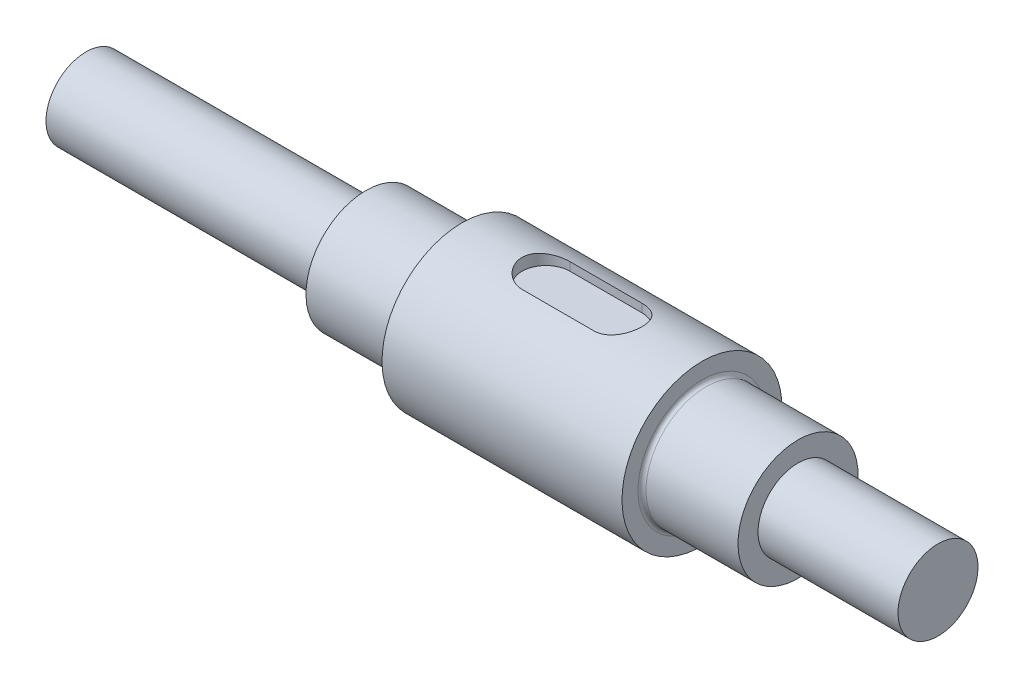
ISO-10303-21;
HEADER;
FILE_DESCRIPTION(('STEP AP214'),'2;1');
FILE_NAME('part.step','',(''),(''),'','','');
FILE_SCHEMA(('AUTOMOTIVE_DESIGN { 1 0 10303 214 1 1 1 1 }'));
ENDSEC;
DATA;
#1=APPLICATION_CONTEXT('core data for automotive mechanical design processes');
#2=APPLICATION_PROTOCOL_DEFINITION('international standard','automotive_design',2000,#1);
#3=PRODUCT_CONTEXT('',#1,'mechanical');
#4=PRODUCT('Part','Part','',(#3));
#5=PRODUCT_RELATED_PRODUCT_CATEGORY('part','',(#4));
#6=PRODUCT_DEFINITION_FORMATION('','',#4);
#7=PRODUCT_DEFINITION_CONTEXT('part definition',#1,'design');
#8=PRODUCT_DEFINITION('design','',#6,#7);
#9=PRODUCT_DEFINITION_SHAPE('','',#8);
#10=(LENGTH_UNIT() NAMED_UNIT(*) SI_UNIT(.MILLI.,.METRE.));
#11=(NAMED_UNIT(*) PLANE_ANGLE_UNIT() SI_UNIT($,.RADIAN.));
#12=(NAMED_UNIT(*) SI_UNIT($,.STERADIAN.) SOLID_ANGLE_UNIT());
#13=UNCERTAINTY_MEASURE_WITH_UNIT(LENGTH_MEASURE(1.E-05),#10,'distance_accuracy_value','');
#14=(GEOMETRIC_REPRESENTATION_CONTEXT(3) GLOBAL_UNCERTAINTY_ASSIGNED_CONTEXT((#13)) GLOBAL_UNIT_ASSIGNED_CONTEXT((#10,
#11,#12)) REPRESENTATION_CONTEXT('',''));
#15=CARTESIAN_POINT('',(0.,0.,0.));
#16=DIRECTION('',(0.,0.,1.));
#17=DIRECTION('',(1.,0.,0.));
#18=AXIS2_PLACEMENT_3D('',#15,#16,#17);
#19=CARTESIAN_POINT('',(-124.,0.,0.));
#20=DIRECTION('',(-1.,0.,0.));
#21=DIRECTION('',(0.,-1.,0.));
#22=AXIS2_PLACEMENT_3D('',#19,#20,#21);
#23=PLANE('',#22);
#24=CARTESIAN_POINT('',(-124.,0.,0.));
#25=DIRECTION('',(1.,0.,0.));
#26=DIRECTION('',(0.,1.,0.));
#27=AXIS2_PLACEMENT_3D('',#24,#25,#26);
#28=CIRCLE('',#27,10.);
#29=CARTESIAN_POINT('',(-124.,10.,0.));
#30=VERTEX_POINT('',#29);
#31=EDGE_CURVE('E128',#30,#30,#28,.T.);
#32=ORIENTED_EDGE('',*,*,#31,.F.);
#33=EDGE_LOOP('',(#32));
#34=FACE_BOUND('',#33,.T.);
#35=ADVANCED_FACE('F38',(#34),#23,.T.);
#36=CARTESIAN_POINT('',(89.,0.,0.));
#37=DIRECTION('',(1.,0.,0.));
#38=DIRECTION('',(0.,1.,0.));
#39=AXIS2_PLACEMENT_3D('',#36,#37,#38);
#40=CYLINDRICAL_SURFACE('',#39,10.);
#41=ORIENTED_EDGE('',*,*,#31,.T.);
#42=EDGE_LOOP('',(#41));
#43=FACE_BOUND('',#42,.T.);
#44=CARTESIAN_POINT('',(-54.,0.,0.));
#45=DIRECTION('',(1.,0.,0.));
#46=DIRECTION('',(0.,1.,0.));
#47=AXIS2_PLACEMENT_3D('',#44,#45,#46);
#48=CIRCLE('',#47,10.);
#49=CARTESIAN_POINT('',(-54.,10.,0.));
#50=VERTEX_POINT('',#49);
#51=EDGE_CURVE('E125',#50,#50,#48,.T.);
#52=ORIENTED_EDGE('',*,*,#51,.F.);
#53=EDGE_LOOP('',(#52));
#54=FACE_BOUND('',#53,.T.);
#55=ADVANCED_FACE('F195',(#43,#54),#40,.T.);
#56=CARTESIAN_POINT('',(-54.,10.,0.));
#57=DIRECTION('',(-1.,0.,0.));
#58=DIRECTION('',(0.,-1.,0.));
#59=AXIS2_PLACEMENT_3D('',#56,#57,#58);
#60=PLANE('',#59);
#61=ORIENTED_EDGE('',*,*,#51,.T.);
#62=EDGE_LOOP('',(#61));
#63=FACE_BOUND('',#62,.T.);
#64=CARTESIAN_POINT('',(-54.,0.,0.));
#65=DIRECTION('',(1.,0.,0.));
#66=DIRECTION('',(0.,1.,0.));
#67=AXIS2_PLACEMENT_3D('',#64,#65,#66);
#68=CIRCLE('',#67,15.);
#69=CARTESIAN_POINT('',(-54.,15.,0.));
#70=VERTEX_POINT('',#69);
#71=EDGE_CURVE('E122',#70,#70,#68,.T.);
#72=ORIENTED_EDGE('',*,*,#71,.F.);
#73=EDGE_LOOP('',(#72));
#74=FACE_BOUND('',#73,.T.);
#75=ADVANCED_FACE('F201',(#63,#74),#60,.T.);
#76=CARTESIAN_POINT('',(89.,0.,0.));
#77=DIRECTION('',(1.,0.,0.));
#78=DIRECTION('',(0.,1.,0.));
#79=AXIS2_PLACEMENT_3D('',#76,#77,#78);
#80=CYLINDRICAL_SURFACE('',#79,15.);
#81=CARTESIAN_POINT('',(-31.,0.,0.));
#82=DIRECTION('',(-1.,0.,0.));
#83=DIRECTION('',(0.,-1.,0.));
#84=AXIS2_PLACEMENT_3D('',#81,#82,#83);
#85=CIRCLE('',#84,15.);
#86=CARTESIAN_POINT('',(-31.,-15.,0.));
#87=VERTEX_POINT('',#86);
#88=EDGE_CURVE('E140',#87,#87,#85,.T.);
#89=ORIENTED_EDGE('',*,*,#88,.T.);
#90=EDGE_LOOP('',(#89));
#91=FACE_BOUND('',#90,.T.);
#92=ORIENTED_EDGE('',*,*,#71,.T.);
#93=EDGE_LOOP('',(#92));
#94=FACE_BOUND('',#93,.T.);
#95=ADVANCED_FACE('F244',(#91,#94),#80,.T.);
#96=CARTESIAN_POINT('',(-30.,15.,0.));
#97=DIRECTION('',(-1.,0.,0.));
#98=DIRECTION('',(0.,-1.,0.));
#99=AXIS2_PLACEMENT_3D('',#96,#97,#98);
#100=PLANE('',#99);
#101=CARTESIAN_POINT('',(-30.,0.,0.));
#102=DIRECTION('',(-1.,0.,0.));
#103=DIRECTION('',(0.,-1.,0.));
#104=AXIS2_PLACEMENT_3D('',#101,#102,#103);
#105=CIRCLE('',#104,16.);
#106=CARTESIAN_POINT('',(-30.,-16.,0.));
#107=VERTEX_POINT('',#106);
#108=EDGE_CURVE('E137',#107,#107,#105,.F.);
#109=ORIENTED_EDGE('',*,*,#108,.T.);
#110=EDGE_LOOP('',(#109));
#111=FACE_BOUND('',#110,.T.);
#112=CARTESIAN_POINT('',(-30.,0.,0.));
#113=DIRECTION('',(1.,0.,0.));
#114=DIRECTION('',(0.,1.,0.));
#115=AXIS2_PLACEMENT_3D('',#112,#113,#114);
#116=CIRCLE('',#115,20.);
#117=CARTESIAN_POINT('',(-30.,20.,0.));
#118=VERTEX_POINT('',#117);
#119=EDGE_CURVE('E119',#118,#118,#116,.T.);
#120=ORIENTED_EDGE('',*,*,#119,.F.);
#121=EDGE_LOOP('',(#120));
#122=FACE_BOUND('',#121,.T.);
#123=ADVANCED_FACE('F179',(#111,#122),#100,.T.);
#124=CARTESIAN_POINT('',(89.,0.,0.));
#125=DIRECTION('',(1.,0.,0.));
#126=DIRECTION('',(0.,1.,0.));
#127=AXIS2_PLACEMENT_3D('',#124,#125,#126);
#128=CYLINDRICAL_SURFACE('',#127,20.);
#129=CARTESIAN_POINT('',(-9.,19.0787840283389,-6.));
#130=CARTESIAN_POINT('',(-9.16466799491076,19.0787603919218,-6.00002230630953));
#131=CARTESIAN_POINT('',(-9.32932738693038,19.0809150948054,-5.99322212828861));
#132=CARTESIAN_POINT('',(-9.65738942838457,19.089408588524,-5.96614198358438));
#133=CARTESIAN_POINT('',(-9.82079235201368,19.0957464386677,-5.94586504749982));
#134=CARTESIAN_POINT('',(-10.1447667936842,19.1124126760415,-5.89206455668659));
#135=CARTESIAN_POINT('',(-10.3053444279638,19.1227309292375,-5.85857463708937));
#136=CARTESIAN_POINT('',(-10.6229623086685,19.1470349488515,-5.77865096251378));
#137=CARTESIAN_POINT('',(-10.7800024624693,19.1610208111801,-5.73221686903431));
#138=CARTESIAN_POINT('',(-11.0893825607235,19.1922338155173,-5.62682620459483));
#139=CARTESIAN_POINT('',(-11.2417252187759,19.2094590438083,-5.56787702452552));
#140=CARTESIAN_POINT('',(-11.5408741429016,19.2466621419291,-5.43788252899624));
#141=CARTESIAN_POINT('',(-11.687678324328,19.2666410353109,-5.36683271334057));
#142=CARTESIAN_POINT('',(-11.9747849452531,19.3087849542851,-5.21317247195195));
#143=CARTESIAN_POINT('',(-12.1150870185297,19.3309501027959,-5.13056139609832));
#144=CARTESIAN_POINT('',(-12.3883877986748,19.3768680311909,-4.95431913401973));
#145=CARTESIAN_POINT('',(-12.5213837168722,19.4006214097184,-4.86068378223771));
#146=CARTESIAN_POINT('',(-12.7828635732296,19.4497584548899,-4.66024014290223));
#147=CARTESIAN_POINT('',(-12.9111151521982,19.4751691904069,-4.55313526362689));
#148=CARTESIAN_POINT('',(-13.1582539370087,19.5263015189751,-4.32860344600265));
#149=CARTESIAN_POINT('',(-13.2771378666711,19.5520232171847,-4.21117292654717));
#150=CARTESIAN_POINT('',(-13.5047413951219,19.6030710031715,-3.96676059198591));
#151=CARTESIAN_POINT('',(-13.6134609320288,19.6283970885393,-3.83977871873938));
#152=CARTESIAN_POINT('',(-13.8200192544725,19.6779706962222,-3.5770569657621));
#153=CARTESIAN_POINT('',(-13.917858125839,19.7022182270443,-3.44131715512968));
#154=CARTESIAN_POINT('',(-14.1039097682599,19.7494715734221,-3.15899953964076));
#155=CARTESIAN_POINT('',(-14.1918780463025,19.7724407517412,-3.01225429870653));
#156=CARTESIAN_POINT('',(-14.355063794055,19.8159158974823,-2.71155717798052));
#157=CARTESIAN_POINT('',(-14.430285978567,19.8364227748921,-2.55760798995096));
#158=CARTESIAN_POINT('',(-14.5674164393714,19.8744001644265,-2.24348996032481));
#159=CARTESIAN_POINT('',(-14.6293222547682,19.8918701152059,-2.08331997555618));
#160=CARTESIAN_POINT('',(-14.7392375024558,19.923254535561,-1.75801430484772));
#161=CARTESIAN_POINT('',(-14.7872529399682,19.9371705413066,-1.59288079897388));
#162=CARTESIAN_POINT('',(-14.8678255467277,19.960709769643,-1.26354510595574));
#163=CARTESIAN_POINT('',(-14.9007806269582,19.9704430293701,-1.09944808925078));
#164=CARTESIAN_POINT('',(-14.9528719972864,19.9858966495547,-0.768952154148945));
#165=CARTESIAN_POINT('',(-14.9720138041346,19.9916186120195,-0.602554181799291));
#166=CARTESIAN_POINT('',(-14.9963199648569,19.9988929276978,-0.268644299740227));
#167=CARTESIAN_POINT('',(-15.0014838943061,20.0004451543012,-0.101132356360974));
#168=CARTESIAN_POINT('',(-14.9977835949215,19.9993350985709,0.233720900410861));
#169=CARTESIAN_POINT('',(-14.9889196235372,19.9966728935831,0.401062216878503));
#170=CARTESIAN_POINT('',(-14.9577577883976,19.9873626800314,0.728949940400309));
#171=CARTESIAN_POINT('',(-14.9358999900172,19.9808452710305,0.889542117296656));
#172=CARTESIAN_POINT('',(-14.8793045182417,19.9641050678088,1.20830021014906));
#173=CARTESIAN_POINT('',(-14.8445624577749,19.9538810115069,1.36646528055415));
#174=CARTESIAN_POINT('',(-14.7625076983902,19.9300014175933,1.67917461818938));
#175=CARTESIAN_POINT('',(-14.7151992242771,19.916347033335,1.83372008335732));
#176=CARTESIAN_POINT('',(-14.6083697289368,19.885954581515,2.13828018933734));
#177=CARTESIAN_POINT('',(-14.5488441160033,19.8692153547843,2.2882931022387));
#178=CARTESIAN_POINT('',(-14.4173094204607,19.8328818557961,2.58443507880942));
#179=CARTESIAN_POINT('',(-14.3451671028017,19.8132575095082,2.7305012482212));
#180=CARTESIAN_POINT('',(-14.1893768526706,19.7717979578185,3.0160963237542));
#181=CARTESIAN_POINT('',(-14.1057249716159,19.7499619943591,3.15562296424241));
#182=CARTESIAN_POINT('',(-13.9275130175587,19.704643118031,3.42724384686891));
#183=CARTESIAN_POINT('',(-13.8329528185717,19.681160186142,3.55933800314027));
#184=CARTESIAN_POINT('',(-13.6335413215712,19.6331439703208,3.81531376455356));
#185=CARTESIAN_POINT('',(-13.5286897234991,19.6086106557752,3.93919513006484));
#186=CARTESIAN_POINT('',(-13.3051027565368,19.5581593507452,4.18263653591652));
#187=CARTESIAN_POINT('',(-13.1859873205257,19.5322244988475,4.30184428600934));
#188=CARTESIAN_POINT('',(-12.9381664964976,19.4806179410542,4.52981041510267));
#189=CARTESIAN_POINT('',(-12.8094642039191,19.454946153239,4.63857214120815));
#190=CARTESIAN_POINT('',(-12.5431596037615,19.4045581786367,4.84504126060965));
#191=CARTESIAN_POINT('',(-12.4055514280994,19.3798426394128,4.94274124635232));
#192=CARTESIAN_POINT('',(-12.1224409076672,19.3321023379674,5.12628631686324));
#193=CARTESIAN_POINT('',(-11.9769416624216,19.3090769201297,5.21213600998877));
#194=CARTESIAN_POINT('',(-11.6773648649068,19.2651525602885,5.37223080367566));
#195=CARTESIAN_POINT('',(-11.5232129213409,19.2442786555291,5.44634371437402));
#196=CARTESIAN_POINT('',(-11.2088781586389,19.2055937237889,5.58122691640503));
#197=CARTESIAN_POINT('',(-11.0486978375224,19.1877814448102,5.64200266456203));
#198=CARTESIAN_POINT('',(-10.7235678816501,19.1557967477957,5.74966145349631));
#199=CARTESIAN_POINT('',(-10.5586234734371,19.1416204978023,5.79655912825487));
#200=CARTESIAN_POINT('',(-10.225106819549,19.1173543231183,5.87609462586438));
#201=CARTESIAN_POINT('',(-10.0565362849515,19.1072625137754,5.90873902604377));
#202=CARTESIAN_POINT('',(-9.74006292976352,19.0925703406668,5.95603131732401));
#203=CARTESIAN_POINT('',(-9.59245829064001,19.0874107715083,5.97251971262425));
#204=CARTESIAN_POINT('',(-9.29657288752471,19.0805126306352,5.99450261914155));
#205=CARTESIAN_POINT('',(-9.14829344042534,19.0787690288453,6.00001329545508));
#206=CARTESIAN_POINT('',(-9.,19.0787840283389,6.));
#207=B_SPLINE_CURVE_WITH_KNOTS('',3,(#129,#130,#131,#132,#133,#134,#135,#136,#137,#138,#139,
#140,#141,#142,#143,#144,#145,#146,#147,#148,#149,#150,#151,#152,#153,#154,#155,#156,#157,#158,
#159,#160,#161,#162,#163,#164,#165,#166,#167,#168,#169,#170,#171,#172,#173,#174,#175,#176,#177,
#178,#179,#180,#181,#182,#183,#184,#185,#186,#187,#188,#189,#190,#191,#192,#193,#194,#195,#196,
#197,#198,#199,#200,#201,#202,#203,#204,#205,#206),.UNSPECIFIED.,.F.,.F.,(4,2,2,2,2,2,2,2,2,2,2,
2,2,2,2,2,2,2,2,2,2,2,2,2,2,2,2,2,2,2,2,2,2,2,2,2,2,2,4),(0.,0.493836284878936,0.98756155541217,
1.48003801924602,1.97252736296405,2.4647266679518,2.95710942192587,3.44951987503683,
3.94211698773001,4.44857898474592,4.95521732942467,5.46185875834846,5.96849619046395,
6.48574341264194,7.00279888450885,7.5199498274806,8.03687685551444,8.53921958328378,
9.04136157401789,9.5435188116382,10.0456668334346,10.531706521874,11.0179118582603,
11.5039539397551,11.9901790315928,12.4818885441265,12.9737671698834,13.4656514771114,
13.9575501300996,14.4684682486943,14.9792221093922,15.4903160010787,16.001210574562,
16.517502934493,17.0335836608614,17.549118241575,18.0644146711719,18.509813123396,
18.9545552237083),.UNSPECIFIED.);
#208=CARTESIAN_POINT('',(-9.,19.0787840283389,-6.));
#209=VERTEX_POINT('',#208);
#210=CARTESIAN_POINT('',(-9.,19.0787840283389,6.));
#211=VERTEX_POINT('',#210);
#212=EDGE_CURVE('E143',#209,#211,#207,.T.);
#213=ORIENTED_EDGE('',*,*,#212,.F.);
#214=DIRECTION('',(1.,0.,0.));
#215=VECTOR('',#214,1.);
#216=CARTESIAN_POINT('',(89.,19.0787840283389,-6.00000000000001));
#217=LINE('',#216,#215);
#218=CARTESIAN_POINT('',(9.,19.0787840283389,-6.));
#219=VERTEX_POINT('',#218);
#220=EDGE_CURVE('E11',#219,#209,#217,.F.);
#221=ORIENTED_EDGE('',*,*,#220,.F.);
#222=CARTESIAN_POINT('',(9.,19.0787840283389,5.99999999999999));
#223=CARTESIAN_POINT('',(9.16466799491076,19.0787603919218,6.00002230630953));
#224=CARTESIAN_POINT('',(9.32932738693038,19.0809150948054,5.99322212828861));
#225=CARTESIAN_POINT('',(9.65738942838457,19.089408588524,5.96614198358438));
#226=CARTESIAN_POINT('',(9.82079235201368,19.0957464386677,5.94586504749982));
#227=CARTESIAN_POINT('',(10.1447667936842,19.1124126760415,5.89206455668659));
#228=CARTESIAN_POINT('',(10.3053444279638,19.1227309292375,5.85857463708937));
#229=CARTESIAN_POINT('',(10.6229623086685,19.1470349488515,5.77865096251377));
#230=CARTESIAN_POINT('',(10.7800024624693,19.1610208111801,5.73221686903431));
#231=CARTESIAN_POINT('',(11.0893825607235,19.1922338155173,5.62682620459483));
#232=CARTESIAN_POINT('',(11.2417252187759,19.2094590438083,5.56787702452552));
#233=CARTESIAN_POINT('',(11.5408741429016,19.2466621419291,5.43788252899624));
#234=CARTESIAN_POINT('',(11.687678324328,19.2666410353109,5.36683271334056));
#235=CARTESIAN_POINT('',(11.9747849452531,19.3087849542851,5.21317247195194));
#236=CARTESIAN_POINT('',(12.1150870185297,19.3309501027959,5.13056139609832));
#237=CARTESIAN_POINT('',(12.3883877986748,19.3768680311909,4.95431913401973));
#238=CARTESIAN_POINT('',(12.5213837168722,19.4006214097184,4.86068378223771));
#239=CARTESIAN_POINT('',(12.7828635732296,19.4497584548899,4.66024014290222));
#240=CARTESIAN_POINT('',(12.9111151521982,19.4751691904069,4.55313526362689));
#241=CARTESIAN_POINT('',(13.1582539370087,19.5263015189751,4.32860344600265));
#242=CARTESIAN_POINT('',(13.2771378666711,19.5520232171847,4.21117292654717));
#243=CARTESIAN_POINT('',(13.5047413951219,19.6030710031715,3.96676059198591));
#244=CARTESIAN_POINT('',(13.6134609320288,19.6283970885393,3.83977871873937));
#245=CARTESIAN_POINT('',(13.8200192544725,19.6779706962222,3.57705696576209));
#246=CARTESIAN_POINT('',(13.9178581258389,19.7022182270443,3.44131715512968));
#247=CARTESIAN_POINT('',(14.1039097682599,19.7494715734221,3.15899953964076));
#248=CARTESIAN_POINT('',(14.1918780463025,19.7724407517412,3.01225429870653));
#249=CARTESIAN_POINT('',(14.355063794055,19.8159158974823,2.71155717798051));
#250=CARTESIAN_POINT('',(14.430285978567,19.8364227748921,2.55760798995095));
#251=CARTESIAN_POINT('',(14.5674164393714,19.8744001644265,2.2434899603248));
#252=CARTESIAN_POINT('',(14.6293222547682,19.8918701152059,2.08331997555618));
#253=CARTESIAN_POINT('',(14.7392375024558,19.923254535561,1.75801430484772));
#254=CARTESIAN_POINT('',(14.7872529399682,19.9371705413066,1.59288079897388));
#255=CARTESIAN_POINT('',(14.8678255467277,19.960709769643,1.26354510595574));
#256=CARTESIAN_POINT('',(14.9007806269582,19.9704430293701,1.09944808925078));
#257=CARTESIAN_POINT('',(14.9528719972864,19.9858966495547,0.768952154148943));
#258=CARTESIAN_POINT('',(14.9720138041346,19.9916186120195,0.602554181799289));
#259=CARTESIAN_POINT('',(14.9963199648569,19.9988929276978,0.268644299740225));
#260=CARTESIAN_POINT('',(15.0014838943061,20.0004451543012,0.101132356360972));
#261=CARTESIAN_POINT('',(14.9977835949215,19.9993350985709,-0.233720900410863));
#262=CARTESIAN_POINT('',(14.9889196235372,19.9966728935831,-0.401062216878505));
#263=CARTESIAN_POINT('',(14.9577577883976,19.9873626800315,-0.728949940400311));
#264=CARTESIAN_POINT('',(14.9358999900172,19.9808452710305,-0.889542117296657));
#265=CARTESIAN_POINT('',(14.8793045182417,19.9641050678088,-1.20830021014906));
#266=CARTESIAN_POINT('',(14.8445624577749,19.9538810115069,-1.36646528055415));
#267=CARTESIAN_POINT('',(14.7625076983902,19.9300014175933,-1.67917461818938));
#268=CARTESIAN_POINT('',(14.7151992242771,19.916347033335,-1.83372008335732));
#269=CARTESIAN_POINT('',(14.6083697289368,19.885954581515,-2.13828018933734));
#270=CARTESIAN_POINT('',(14.5488441160033,19.8692153547843,-2.2882931022387));
#271=CARTESIAN_POINT('',(14.4173094204607,19.8328818557961,-2.58443507880942));
#272=CARTESIAN_POINT('',(14.3451671028017,19.8132575095082,-2.7305012482212));
#273=CARTESIAN_POINT('',(14.1893768526706,19.7717979578185,-3.01609632375421));
#274=CARTESIAN_POINT('',(14.1057249716159,19.7499619943591,-3.15562296424241));
#275=CARTESIAN_POINT('',(13.9275130175587,19.704643118031,-3.42724384686891));
#276=CARTESIAN_POINT('',(13.8329528185717,19.681160186142,-3.55933800314027));
#277=CARTESIAN_POINT('',(13.6335413215712,19.6331439703208,-3.81531376455356));
#278=CARTESIAN_POINT('',(13.5286897234991,19.6086106557752,-3.93919513006484));
#279=CARTESIAN_POINT('',(13.3051027565368,19.5581593507452,-4.18263653591652));
#280=CARTESIAN_POINT('',(13.1859873205257,19.5322244988475,-4.30184428600934));
#281=CARTESIAN_POINT('',(12.9381664964976,19.4806179410542,-4.52981041510267));
#282=CARTESIAN_POINT('',(12.8094642039191,19.454946153239,-4.63857214120815));
#283=CARTESIAN_POINT('',(12.5431596037615,19.4045581786367,-4.84504126060965));
#284=CARTESIAN_POINT('',(12.4055514280994,19.3798426394128,-4.94274124635232));
#285=CARTESIAN_POINT('',(12.1224409076672,19.3321023379674,-5.12628631686324));
#286=CARTESIAN_POINT('',(11.9769416624216,19.3090769201297,-5.21213600998877));
#287=CARTESIAN_POINT('',(11.6773648649068,19.2651525602885,-5.37223080367566));
#288=CARTESIAN_POINT('',(11.523212921341,19.2442786555291,-5.44634371437402));
#289=CARTESIAN_POINT('',(11.2088781586389,19.2055937237889,-5.58122691640503));
#290=CARTESIAN_POINT('',(11.0486978375224,19.1877814448102,-5.64200266456203));
#291=CARTESIAN_POINT('',(10.7235678816501,19.1557967477957,-5.74966145349631));
#292=CARTESIAN_POINT('',(10.5586234734371,19.1416204978023,-5.79655912825487));
#293=CARTESIAN_POINT('',(10.225106819549,19.1173543231183,-5.87609462586438));
#294=CARTESIAN_POINT('',(10.0565362849515,19.1072625137754,-5.90873902604377));
#295=CARTESIAN_POINT('',(9.74006292976352,19.0925703406668,-5.95603131732401));
#296=CARTESIAN_POINT('',(9.59245829064001,19.0874107715083,-5.97251971262425));
#297=CARTESIAN_POINT('',(9.2965728875247,19.0805126306352,-5.99450261914156));
#298=CARTESIAN_POINT('',(9.14829344042534,19.0787690288453,-6.00001329545508));
#299=CARTESIAN_POINT('',(9.,19.0787840283389,-6.));
#300=B_SPLINE_CURVE_WITH_KNOTS('',3,(#222,#223,#224,#225,#226,#227,#228,#229,#230,#231,#232,
#233,#234,#235,#236,#237,#238,#239,#240,#241,#242,#243,#244,#245,#246,#247,#248,#249,#250,#251,
#252,#253,#254,#255,#256,#257,#258,#259,#260,#261,#262,#263,#264,#265,#266,#267,#268,#269,#270,
#271,#272,#273,#274,#275,#276,#277,#278,#279,#280,#281,#282,#283,#284,#285,#286,#287,#288,#289,
#290,#291,#292,#293,#294,#295,#296,#297,#298,#299),.UNSPECIFIED.,.F.,.F.,(4,2,2,2,2,2,2,2,2,2,2,
2,2,2,2,2,2,2,2,2,2,2,2,2,2,2,2,2,2,2,2,2,2,2,2,2,2,2,4),(0.,0.493836284878936,0.98756155541217,
1.48003801924602,1.97252736296405,2.4647266679518,2.95710942192587,3.44951987503683,
3.94211698773001,4.44857898474592,4.95521732942467,5.46185875834846,5.96849619046395,
6.48574341264194,7.00279888450885,7.5199498274806,8.03687685551444,8.53921958328378,
9.04136157401789,9.5435188116382,10.0456668334346,10.531706521874,11.0179118582603,
11.5039539397551,11.9901790315928,12.4818885441265,12.9737671698834,13.4656514771114,
13.9575501300996,14.4684682486942,14.9792221093922,15.4903160010787,16.001210574562,
16.517502934493,17.0335836608614,17.549118241575,18.0644146711719,18.509813123396,
18.9545552237083),.UNSPECIFIED.);
#301=CARTESIAN_POINT('',(9.,19.0787840283389,6.));
#302=VERTEX_POINT('',#301);
#303=EDGE_CURVE('E46',#302,#219,#300,.T.);
#304=ORIENTED_EDGE('',*,*,#303,.F.);
#305=DIRECTION('',(1.,0.,0.));
#306=VECTOR('',#305,1.);
#307=CARTESIAN_POINT('',(89.,19.0787840283389,5.99999999999999));
#308=LINE('',#307,#306);
#309=EDGE_CURVE('E151',#211,#302,#308,.T.);
#310=ORIENTED_EDGE('',*,*,#309,.F.);
#311=EDGE_LOOP('',(#213,#221,#304,#310));
#312=FACE_BOUND('',#311,.T.);
#313=ORIENTED_EDGE('',*,*,#119,.T.);
#314=EDGE_LOOP('',(#313));
#315=FACE_BOUND('',#314,.T.);
#316=CARTESIAN_POINT('',(30.,0.,0.));
#317=DIRECTION('',(1.,0.,0.));
#318=DIRECTION('',(0.,1.,0.));
#319=AXIS2_PLACEMENT_3D('',#316,#317,#318);
#320=CIRCLE('',#319,20.);
#321=CARTESIAN_POINT('',(30.,20.,0.));
#322=VERTEX_POINT('',#321);
#323=EDGE_CURVE('E116',#322,#322,#320,.T.);
#324=ORIENTED_EDGE('',*,*,#323,.F.);
#325=EDGE_LOOP('',(#324));
#326=FACE_BOUND('',#325,.T.);
#327=ADVANCED_FACE('F152',(#312,#315,#326),#128,.T.);
#328=CARTESIAN_POINT('',(30.,15.,0.));
#329=DIRECTION('',(1.,0.,0.));
#330=DIRECTION('',(0.,1.,0.));
#331=AXIS2_PLACEMENT_3D('',#328,#329,#330);
#332=PLANE('',#331);
#333=CARTESIAN_POINT('',(30.,0.,0.));
#334=DIRECTION('',(1.,0.,0.));
#335=DIRECTION('',(0.,1.,0.));
#336=AXIS2_PLACEMENT_3D('',#333,#334,#335);
#337=CIRCLE('',#336,16.);
#338=CARTESIAN_POINT('',(30.,16.,0.));
#339=VERTEX_POINT('',#338);
#340=EDGE_CURVE('E134',#339,#339,#337,.F.);
#341=ORIENTED_EDGE('',*,*,#340,.T.);
#342=EDGE_LOOP('',(#341));
#343=FACE_BOUND('',#342,.T.);
#344=ORIENTED_EDGE('',*,*,#323,.T.);
#345=EDGE_LOOP('',(#344));
#346=FACE_BOUND('',#345,.T.);
#347=ADVANCED_FACE('F178',(#343,#346),#332,.T.);
#348=CARTESIAN_POINT('',(89.,0.,0.));
#349=DIRECTION('',(1.,0.,0.));
#350=DIRECTION('',(0.,1.,0.));
#351=AXIS2_PLACEMENT_3D('',#348,#349,#350);
#352=CYLINDRICAL_SURFACE('',#351,15.);
#353=CARTESIAN_POINT('',(31.,0.,0.));
#354=DIRECTION('',(1.,0.,0.));
#355=DIRECTION('',(0.,1.,0.));
#356=AXIS2_PLACEMENT_3D('',#353,#354,#355);
#357=CIRCLE('',#356,15.);
#358=CARTESIAN_POINT('',(31.,15.,0.));
#359=VERTEX_POINT('',#358);
#360=EDGE_CURVE('E131',#359,#359,#357,.T.);
#361=ORIENTED_EDGE('',*,*,#360,.T.);
#362=EDGE_LOOP('',(#361));
#363=FACE_BOUND('',#362,.T.);
#364=CARTESIAN_POINT('',(54.,0.,0.));
#365=DIRECTION('',(1.,0.,0.));
#366=DIRECTION('',(0.,1.,0.));
#367=AXIS2_PLACEMENT_3D('',#364,#365,#366);
#368=CIRCLE('',#367,15.);
#369=CARTESIAN_POINT('',(54.,15.,0.));
#370=VERTEX_POINT('',#369);
#371=EDGE_CURVE('E113',#370,#370,#368,.T.);
#372=ORIENTED_EDGE('',*,*,#371,.F.);
#373=EDGE_LOOP('',(#372));
#374=FACE_BOUND('',#373,.T.);
#375=ADVANCED_FACE('F185',(#363,#374),#352,.T.);
#376=CARTESIAN_POINT('',(54.,10.,0.));
#377=DIRECTION('',(1.,0.,0.));
#378=DIRECTION('',(0.,1.,0.));
#379=AXIS2_PLACEMENT_3D('',#376,#377,#378);
#380=PLANE('',#379);
#381=ORIENTED_EDGE('',*,*,#371,.T.);
#382=EDGE_LOOP('',(#381));
#383=FACE_BOUND('',#382,.T.);
#384=CARTESIAN_POINT('',(54.,0.,0.));
#385=DIRECTION('',(1.,0.,0.));
#386=DIRECTION('',(0.,1.,0.));
#387=AXIS2_PLACEMENT_3D('',#384,#385,#386);
#388=CIRCLE('',#387,10.);
#389=CARTESIAN_POINT('',(54.,10.,0.));
#390=VERTEX_POINT('',#389);
#391=EDGE_CURVE('E110',#390,#390,#388,.T.);
#392=ORIENTED_EDGE('',*,*,#391,.F.);
#393=EDGE_LOOP('',(#392));
#394=FACE_BOUND('',#393,.T.);
#395=ADVANCED_FACE('F191',(#383,#394),#380,.T.);
#396=CARTESIAN_POINT('',(89.,0.,0.));
#397=DIRECTION('',(1.,0.,0.));
#398=DIRECTION('',(0.,1.,0.));
#399=AXIS2_PLACEMENT_3D('',#396,#397,#398);
#400=CYLINDRICAL_SURFACE('',#399,10.);
#401=ORIENTED_EDGE('',*,*,#391,.T.);
#402=EDGE_LOOP('',(#401));
#403=FACE_BOUND('',#402,.T.);
#404=CARTESIAN_POINT('',(89.,0.,0.));
#405=DIRECTION('',(1.,0.,0.));
#406=DIRECTION('',(0.,1.,0.));
#407=AXIS2_PLACEMENT_3D('',#404,#405,#406);
#408=CIRCLE('',#407,10.);
#409=CARTESIAN_POINT('',(89.,10.,0.));
#410=VERTEX_POINT('',#409);
#411=EDGE_CURVE('E103',#410,#410,#408,.T.);
#412=ORIENTED_EDGE('',*,*,#411,.F.);
#413=EDGE_LOOP('',(#412));
#414=FACE_BOUND('',#413,.T.);
#415=ADVANCED_FACE('F214',(#403,#414),#400,.T.);
#416=CARTESIAN_POINT('',(89.,10.,0.));
#417=DIRECTION('',(1.,0.,0.));
#418=DIRECTION('',(0.,1.,0.));
#419=AXIS2_PLACEMENT_3D('',#416,#417,#418);
#420=PLANE('',#419);
#421=ORIENTED_EDGE('',*,*,#411,.T.);
#422=EDGE_LOOP('',(#421));
#423=FACE_BOUND('',#422,.T.);
#424=ADVANCED_FACE('F169',(#423),#420,.T.);
#425=CARTESIAN_POINT('',(31.,0.,0.));
#426=DIRECTION('',(1.,0.,0.));
#427=DIRECTION('',(0.,1.,0.));
#428=AXIS2_PLACEMENT_3D('',#425,#426,#427);
#429=TOROIDAL_SURFACE('',#428,16.,1.);
#430=ORIENTED_EDGE('',*,*,#340,.F.);
#431=EDGE_LOOP('',(#430));
#432=FACE_BOUND('',#431,.T.);
#433=ORIENTED_EDGE('',*,*,#360,.F.);
#434=EDGE_LOOP('',(#433));
#435=FACE_BOUND('',#434,.T.);
#436=ADVANCED_FACE('F206',(#432,#435),#429,.F.);
#437=CARTESIAN_POINT('',(-31.,0.,0.));
#438=DIRECTION('',(-1.,0.,0.));
#439=DIRECTION('',(0.,-1.,0.));
#440=AXIS2_PLACEMENT_3D('',#437,#438,#439);
#441=TOROIDAL_SURFACE('',#440,16.,1.);
#442=ORIENTED_EDGE('',*,*,#88,.F.);
#443=EDGE_LOOP('',(#442));
#444=FACE_BOUND('',#443,.T.);
#445=ORIENTED_EDGE('',*,*,#108,.F.);
#446=EDGE_LOOP('',(#445));
#447=FACE_BOUND('',#446,.T.);
#448=ADVANCED_FACE('F40',(#444,#447),#441,.F.);
#449=CARTESIAN_POINT('',(9.,17.,0.));
#450=DIRECTION('',(0.,1.,0.));
#451=DIRECTION('',(0.,0.,1.));
#452=AXIS2_PLACEMENT_3D('',#449,#450,#451);
#453=CYLINDRICAL_SURFACE('',#452,6.);
#454=DIRECTION('',(0.,1.,0.));
#455=VECTOR('',#454,1.);
#456=CARTESIAN_POINT('',(9.,17.,6.));
#457=LINE('',#456,#455);
#458=CARTESIAN_POINT('',(9.,17.,6.));
#459=VERTEX_POINT('',#458);
#460=EDGE_CURVE('E101',#459,#302,#457,.T.);
#461=ORIENTED_EDGE('',*,*,#460,.T.);
#462=ORIENTED_EDGE('',*,*,#303,.T.);
#463=DIRECTION('',(0.,1.,0.));
#464=VECTOR('',#463,1.);
#465=CARTESIAN_POINT('',(9.,17.,-6.));
#466=LINE('',#465,#464);
#467=CARTESIAN_POINT('',(9.,17.,-6.));
#468=VERTEX_POINT('',#467);
#469=EDGE_CURVE('E52',#468,#219,#466,.T.);
#470=ORIENTED_EDGE('',*,*,#469,.F.);
#471=CARTESIAN_POINT('',(9.,17.,0.));
#472=DIRECTION('',(0.,1.,0.));
#473=DIRECTION('',(0.,0.,1.));
#474=AXIS2_PLACEMENT_3D('',#471,#472,#473);
#475=CIRCLE('',#474,6.);
#476=EDGE_CURVE('E81',#459,#468,#475,.T.);
#477=ORIENTED_EDGE('',*,*,#476,.F.);
#478=EDGE_LOOP('',(#461,#462,#470,#477));
#479=FACE_BOUND('',#478,.T.);
#480=ADVANCED_FACE('F79',(#479),#453,.F.);
#481=CARTESIAN_POINT('',(9.,17.,6.));
#482=DIRECTION('',(0.,0.,1.));
#483=DIRECTION('',(1.,0.,0.));
#484=AXIS2_PLACEMENT_3D('',#481,#482,#483);
#485=PLANE('',#484);
#486=ORIENTED_EDGE('',*,*,#309,.T.);
#487=ORIENTED_EDGE('',*,*,#460,.F.);
#488=DIRECTION('',(1.,0.,0.));
#489=VECTOR('',#488,1.);
#490=CARTESIAN_POINT('',(9.,17.,6.));
#491=LINE('',#490,#489);
#492=CARTESIAN_POINT('',(-9.,17.,6.));
#493=VERTEX_POINT('',#492);
#494=EDGE_CURVE('E84',#493,#459,#491,.T.);
#495=ORIENTED_EDGE('',*,*,#494,.F.);
#496=DIRECTION('',(0.,1.,0.));
#497=VECTOR('',#496,1.);
#498=CARTESIAN_POINT('',(-9.,17.,6.));
#499=LINE('',#498,#497);
#500=EDGE_CURVE('E104',#493,#211,#499,.T.);
#501=ORIENTED_EDGE('',*,*,#500,.T.);
#502=EDGE_LOOP('',(#486,#487,#495,#501));
#503=FACE_BOUND('',#502,.T.);
#504=ADVANCED_FACE('F161',(#503),#485,.F.);
#505=CARTESIAN_POINT('',(-9.,17.,0.));
#506=DIRECTION('',(0.,1.,0.));
#507=DIRECTION('',(0.,0.,1.));
#508=AXIS2_PLACEMENT_3D('',#505,#506,#507);
#509=CYLINDRICAL_SURFACE('',#508,6.);
#510=DIRECTION('',(0.,1.,0.));
#511=VECTOR('',#510,1.);
#512=CARTESIAN_POINT('',(-9.,17.,-6.));
#513=LINE('',#512,#511);
#514=CARTESIAN_POINT('',(-9.,17.,-6.));
#515=VERTEX_POINT('',#514);
#516=EDGE_CURVE('E83',#515,#209,#513,.T.);
#517=ORIENTED_EDGE('',*,*,#516,.T.);
#518=ORIENTED_EDGE('',*,*,#212,.T.);
#519=ORIENTED_EDGE('',*,*,#500,.F.);
#520=CARTESIAN_POINT('',(-9.,17.,0.));
#521=DIRECTION('',(0.,1.,0.));
#522=DIRECTION('',(0.,0.,1.));
#523=AXIS2_PLACEMENT_3D('',#520,#521,#522);
#524=CIRCLE('',#523,6.);
#525=EDGE_CURVE('E93',#515,#493,#524,.T.);
#526=ORIENTED_EDGE('',*,*,#525,.F.);
#527=EDGE_LOOP('',(#517,#518,#519,#526));
#528=FACE_BOUND('',#527,.T.);
#529=ADVANCED_FACE('F156',(#528),#509,.F.);
#530=CARTESIAN_POINT('',(9.,17.,-6.));
#531=DIRECTION('',(0.,0.,-1.));
#532=DIRECTION('',(-1.,0.,0.));
#533=AXIS2_PLACEMENT_3D('',#530,#531,#532);
#534=PLANE('',#533);
#535=ORIENTED_EDGE('',*,*,#220,.T.);
#536=ORIENTED_EDGE('',*,*,#516,.F.);
#537=DIRECTION('',(-1.,0.,0.));
#538=VECTOR('',#537,1.);
#539=CARTESIAN_POINT('',(9.,17.,-6.));
#540=LINE('',#539,#538);
#541=EDGE_CURVE('E87',#468,#515,#540,.T.);
#542=ORIENTED_EDGE('',*,*,#541,.F.);
#543=ORIENTED_EDGE('',*,*,#469,.T.);
#544=EDGE_LOOP('',(#535,#536,#542,#543));
#545=FACE_BOUND('',#544,.T.);
#546=ADVANCED_FACE('F88',(#545),#534,.F.);
#547=CARTESIAN_POINT('',(9.,17.,0.));
#548=DIRECTION('',(0.,1.,0.));
#549=DIRECTION('',(0.,0.,1.));
#550=AXIS2_PLACEMENT_3D('',#547,#548,#549);
#551=PLANE('',#550);
#552=ORIENTED_EDGE('',*,*,#476,.T.);
#553=ORIENTED_EDGE('',*,*,#541,.T.);
#554=ORIENTED_EDGE('',*,*,#525,.T.);
#555=ORIENTED_EDGE('',*,*,#494,.T.);
#556=EDGE_LOOP('',(#552,#553,#554,#555));
#557=FACE_BOUND('',#556,.T.);
#558=ADVANCED_FACE('F95',(#557),#551,.T.);
#559=CLOSED_SHELL('',(#35,#55,#75,#95,#123,#327,#347,#375,#395,#415,#424,#436,#448,#480,#504,
#529,#546,#558));
#560=MANIFOLD_SOLID_BREP('B2',#559);
#561=ADVANCED_BREP_SHAPE_REPRESENTATION('',(#18,#560),#14);
#562=SHAPE_DEFINITION_REPRESENTATION(#9,#561);
ENDSEC;
END-ISO-10303-21;
